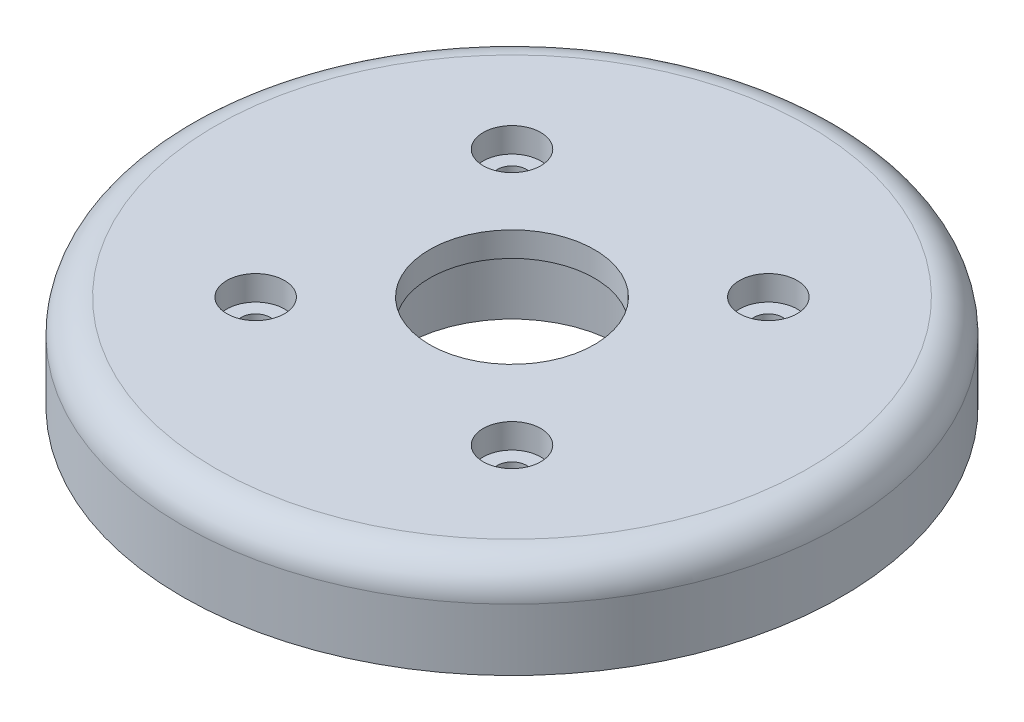
ISO-10303-21;
HEADER;
FILE_DESCRIPTION(('STEP AP214'),'2;1');
FILE_NAME('part.step','',(''),(''),'','','');
FILE_SCHEMA(('AUTOMOTIVE_DESIGN { 1 0 10303 214 1 1 1 1 }'));
ENDSEC;
DATA;
#1=APPLICATION_CONTEXT('core data for automotive mechanical design processes');
#2=APPLICATION_PROTOCOL_DEFINITION('international standard','automotive_design',2000,#1);
#3=PRODUCT_CONTEXT('',#1,'mechanical');
#4=PRODUCT('Part','Part','',(#3));
#5=PRODUCT_RELATED_PRODUCT_CATEGORY('part','',(#4));
#6=PRODUCT_DEFINITION_FORMATION('','',#4);
#7=PRODUCT_DEFINITION_CONTEXT('part definition',#1,'design');
#8=PRODUCT_DEFINITION('design','',#6,#7);
#9=PRODUCT_DEFINITION_SHAPE('','',#8);
#10=(LENGTH_UNIT() NAMED_UNIT(*) SI_UNIT(.MILLI.,.METRE.));
#11=(NAMED_UNIT(*) PLANE_ANGLE_UNIT() SI_UNIT($,.RADIAN.));
#12=(NAMED_UNIT(*) SI_UNIT($,.STERADIAN.) SOLID_ANGLE_UNIT());
#13=UNCERTAINTY_MEASURE_WITH_UNIT(LENGTH_MEASURE(1.E-05),#10,'distance_accuracy_value','');
#14=(GEOMETRIC_REPRESENTATION_CONTEXT(3) GLOBAL_UNCERTAINTY_ASSIGNED_CONTEXT((#13)) GLOBAL_UNIT_ASSIGNED_CONTEXT((#10,
#11,#12)) REPRESENTATION_CONTEXT('',''));
#15=CARTESIAN_POINT('',(0.,0.,0.));
#16=DIRECTION('',(0.,0.,1.));
#17=DIRECTION('',(1.,0.,0.));
#18=AXIS2_PLACEMENT_3D('',#15,#16,#17);
#19=CARTESIAN_POINT('',(0.,8.5,0.));
#20=DIRECTION('',(0.,1.,0.));
#21=DIRECTION('',(0.,0.,1.));
#22=AXIS2_PLACEMENT_3D('',#19,#20,#21);
#23=PLANE('',#22);
#24=CARTESIAN_POINT('',(-15.556349186104,8.5,-15.5563491861041));
#25=DIRECTION('',(0.,1.,0.));
#26=DIRECTION('',(0.,0.,1.));
#27=AXIS2_PLACEMENT_3D('',#24,#25,#26);
#28=CIRCLE('',#27,1.75);
#29=CARTESIAN_POINT('',(-15.556349186104,8.5,-13.8063491861041));
#30=VERTEX_POINT('',#29);
#31=EDGE_CURVE('E63',#30,#30,#28,.T.);
#32=ORIENTED_EDGE('',*,*,#31,.F.);
#33=EDGE_LOOP('',(#32));
#34=FACE_BOUND('',#33,.T.);
#35=CARTESIAN_POINT('',(-15.556349186104,8.5,-15.5563491861041));
#36=DIRECTION('',(0.,1.,0.));
#37=DIRECTION('',(0.,0.,1.));
#38=AXIS2_PLACEMENT_3D('',#35,#36,#37);
#39=CIRCLE('',#38,3.5);
#40=CARTESIAN_POINT('',(-15.556349186104,8.5,-12.0563491861041));
#41=VERTEX_POINT('',#40);
#42=EDGE_CURVE('E91',#41,#41,#39,.T.);
#43=ORIENTED_EDGE('',*,*,#42,.T.);
#44=EDGE_LOOP('',(#43));
#45=FACE_BOUND('',#44,.T.);
#46=ADVANCED_FACE('F37',(#34,#45),#23,.T.);
#47=CARTESIAN_POINT('',(15.5563491861041,8.5,-15.5563491861041));
#48=DIRECTION('',(0.,1.,0.));
#49=DIRECTION('',(0.,0.,1.));
#50=AXIS2_PLACEMENT_3D('',#47,#48,#49);
#51=CIRCLE('',#50,1.74999999999999);
#52=CARTESIAN_POINT('',(15.5563491861041,8.5,-13.8063491861041));
#53=VERTEX_POINT('',#52);
#54=EDGE_CURVE('E66',#53,#53,#51,.T.);
#55=ORIENTED_EDGE('',*,*,#54,.F.);
#56=EDGE_LOOP('',(#55));
#57=FACE_BOUND('',#56,.T.);
#58=CARTESIAN_POINT('',(15.5563491861041,8.5,-15.5563491861041));
#59=DIRECTION('',(0.,1.,0.));
#60=DIRECTION('',(0.,0.,1.));
#61=AXIS2_PLACEMENT_3D('',#58,#59,#60);
#62=CIRCLE('',#61,3.5);
#63=CARTESIAN_POINT('',(15.5563491861041,8.5,-12.0563491861041));
#64=VERTEX_POINT('',#63);
#65=EDGE_CURVE('E97',#64,#64,#62,.T.);
#66=ORIENTED_EDGE('',*,*,#65,.T.);
#67=EDGE_LOOP('',(#66));
#68=FACE_BOUND('',#67,.T.);
#69=ADVANCED_FACE('F138',(#57,#68),#23,.T.);
#70=CARTESIAN_POINT('',(15.5563491861041,8.5,15.556349186104));
#71=DIRECTION('',(0.,1.,0.));
#72=DIRECTION('',(0.,0.,1.));
#73=AXIS2_PLACEMENT_3D('',#70,#71,#72);
#74=CIRCLE('',#73,1.75000000000023);
#75=CARTESIAN_POINT('',(15.5563491861041,8.5,17.3063491861042));
#76=VERTEX_POINT('',#75);
#77=EDGE_CURVE('E77',#76,#76,#74,.T.);
#78=ORIENTED_EDGE('',*,*,#77,.F.);
#79=EDGE_LOOP('',(#78));
#80=FACE_BOUND('',#79,.T.);
#81=CARTESIAN_POINT('',(15.5563491861041,8.5,15.556349186104));
#82=DIRECTION('',(0.,1.,0.));
#83=DIRECTION('',(0.,0.,1.));
#84=AXIS2_PLACEMENT_3D('',#81,#82,#83);
#85=CIRCLE('',#84,3.5);
#86=CARTESIAN_POINT('',(15.5563491861041,8.5,19.056349186104));
#87=VERTEX_POINT('',#86);
#88=EDGE_CURVE('E103',#87,#87,#85,.T.);
#89=ORIENTED_EDGE('',*,*,#88,.T.);
#90=EDGE_LOOP('',(#89));
#91=FACE_BOUND('',#90,.T.);
#92=ADVANCED_FACE('F145',(#80,#91),#23,.T.);
#93=CARTESIAN_POINT('',(-15.556349186104,8.5,15.556349186104));
#94=DIRECTION('',(0.,1.,0.));
#95=DIRECTION('',(0.,0.,1.));
#96=AXIS2_PLACEMENT_3D('',#93,#94,#95);
#97=CIRCLE('',#96,1.75000000000022);
#98=CARTESIAN_POINT('',(-15.556349186104,8.5,17.3063491861042));
#99=VERTEX_POINT('',#98);
#100=EDGE_CURVE('E71',#99,#99,#97,.T.);
#101=ORIENTED_EDGE('',*,*,#100,.F.);
#102=EDGE_LOOP('',(#101));
#103=FACE_BOUND('',#102,.T.);
#104=CARTESIAN_POINT('',(-15.556349186104,8.5,15.556349186104));
#105=DIRECTION('',(0.,1.,0.));
#106=DIRECTION('',(0.,0.,1.));
#107=AXIS2_PLACEMENT_3D('',#104,#105,#106);
#108=CIRCLE('',#107,3.5);
#109=CARTESIAN_POINT('',(-15.556349186104,8.5,19.056349186104));
#110=VERTEX_POINT('',#109);
#111=EDGE_CURVE('E109',#110,#110,#108,.T.);
#112=ORIENTED_EDGE('',*,*,#111,.T.);
#113=EDGE_LOOP('',(#112));
#114=FACE_BOUND('',#113,.T.);
#115=ADVANCED_FACE('F141',(#103,#114),#23,.T.);
#116=CARTESIAN_POINT('',(0.,0.,0.));
#117=DIRECTION('',(0.,1.,0.));
#118=DIRECTION('',(0.,0.,1.));
#119=AXIS2_PLACEMENT_3D('',#116,#117,#118);
#120=PLANE('',#119);
#121=CARTESIAN_POINT('',(-15.556349186104,0.,15.556349186104));
#122=DIRECTION('',(0.,1.,0.));
#123=DIRECTION('',(0.,0.,1.));
#124=AXIS2_PLACEMENT_3D('',#121,#122,#123);
#125=CIRCLE('',#124,1.75000000000022);
#126=CARTESIAN_POINT('',(-15.556349186104,0.,17.3063491861042));
#127=VERTEX_POINT('',#126);
#128=EDGE_CURVE('E61',#127,#127,#125,.T.);
#129=ORIENTED_EDGE('',*,*,#128,.T.);
#130=EDGE_LOOP('',(#129));
#131=FACE_BOUND('',#130,.T.);
#132=CARTESIAN_POINT('',(15.5563491861041,0.,15.556349186104));
#133=DIRECTION('',(0.,1.,0.));
#134=DIRECTION('',(0.,0.,1.));
#135=AXIS2_PLACEMENT_3D('',#132,#133,#134);
#136=CIRCLE('',#135,1.75000000000023);
#137=CARTESIAN_POINT('',(15.5563491861041,0.,17.3063491861042));
#138=VERTEX_POINT('',#137);
#139=EDGE_CURVE('E74',#138,#138,#136,.T.);
#140=ORIENTED_EDGE('',*,*,#139,.T.);
#141=EDGE_LOOP('',(#140));
#142=FACE_BOUND('',#141,.T.);
#143=CARTESIAN_POINT('',(15.5563491861041,0.,-15.5563491861041));
#144=DIRECTION('',(0.,1.,0.));
#145=DIRECTION('',(0.,0.,1.));
#146=AXIS2_PLACEMENT_3D('',#143,#144,#145);
#147=CIRCLE('',#146,1.74999999999999);
#148=CARTESIAN_POINT('',(15.5563491861041,0.,-13.8063491861041));
#149=VERTEX_POINT('',#148);
#150=EDGE_CURVE('E80',#149,#149,#147,.T.);
#151=ORIENTED_EDGE('',*,*,#150,.T.);
#152=EDGE_LOOP('',(#151));
#153=FACE_BOUND('',#152,.T.);
#154=CARTESIAN_POINT('',(-15.556349186104,0.,-15.5563491861041));
#155=DIRECTION('',(0.,1.,0.));
#156=DIRECTION('',(0.,0.,1.));
#157=AXIS2_PLACEMENT_3D('',#154,#155,#156);
#158=CIRCLE('',#157,1.75);
#159=CARTESIAN_POINT('',(-15.556349186104,0.,-13.8063491861041));
#160=VERTEX_POINT('',#159);
#161=EDGE_CURVE('E57',#160,#160,#158,.T.);
#162=ORIENTED_EDGE('',*,*,#161,.T.);
#163=EDGE_LOOP('',(#162));
#164=FACE_BOUND('',#163,.T.);
#165=CARTESIAN_POINT('',(0.,0.,0.));
#166=DIRECTION('',(0.,1.,0.));
#167=DIRECTION('',(0.,0.,1.));
#168=AXIS2_PLACEMENT_3D('',#165,#166,#167);
#169=CIRCLE('',#168,40.);
#170=CARTESIAN_POINT('',(0.,0.,40.));
#171=VERTEX_POINT('',#170);
#172=EDGE_CURVE('E48',#171,#171,#169,.T.);
#173=ORIENTED_EDGE('',*,*,#172,.F.);
#174=EDGE_LOOP('',(#173));
#175=FACE_BOUND('',#174,.T.);
#176=CARTESIAN_POINT('',(0.,0.,0.));
#177=DIRECTION('',(0.,1.,0.));
#178=DIRECTION('',(0.,0.,1.));
#179=AXIS2_PLACEMENT_3D('',#176,#177,#178);
#180=CIRCLE('',#179,13.);
#181=CARTESIAN_POINT('',(0.,0.,13.));
#182=VERTEX_POINT('',#181);
#183=EDGE_CURVE('E52',#182,#182,#180,.T.);
#184=ORIENTED_EDGE('',*,*,#183,.T.);
#185=EDGE_LOOP('',(#184));
#186=FACE_BOUND('',#185,.T.);
#187=ADVANCED_FACE('F152',(#131,#142,#153,#164,#175,#186),#120,.F.);
#188=CARTESIAN_POINT('',(0.,8.5,0.));
#189=DIRECTION('',(0.,-1.,0.));
#190=DIRECTION('',(0.,0.,-1.));
#191=AXIS2_PLACEMENT_3D('',#188,#189,#190);
#192=CYLINDRICAL_SURFACE('',#191,40.);
#193=CARTESIAN_POINT('',(0.,7.5,0.));
#194=DIRECTION('',(0.,1.,0.));
#195=DIRECTION('',(0.,0.,1.));
#196=AXIS2_PLACEMENT_3D('',#193,#194,#195);
#197=CIRCLE('',#196,40.);
#198=CARTESIAN_POINT('',(0.,7.5,40.));
#199=VERTEX_POINT('',#198);
#200=EDGE_CURVE('E10',#199,#199,#197,.F.);
#201=ORIENTED_EDGE('',*,*,#200,.T.);
#202=EDGE_LOOP('',(#201));
#203=FACE_BOUND('',#202,.T.);
#204=ORIENTED_EDGE('',*,*,#172,.T.);
#205=EDGE_LOOP('',(#204));
#206=FACE_BOUND('',#205,.T.);
#207=ADVANCED_FACE('F158',(#203,#206),#192,.T.);
#208=CARTESIAN_POINT('',(0.,8.5,0.));
#209=DIRECTION('',(0.,-1.,0.));
#210=DIRECTION('',(0.,0.,-1.));
#211=AXIS2_PLACEMENT_3D('',#208,#209,#210);
#212=CYLINDRICAL_SURFACE('',#211,13.);
#213=CARTESIAN_POINT('',(0.,8.5,0.));
#214=DIRECTION('',(0.,1.,0.));
#215=DIRECTION('',(0.,0.,1.));
#216=AXIS2_PLACEMENT_3D('',#213,#214,#215);
#217=CIRCLE('',#216,13.);
#218=CARTESIAN_POINT('',(0.,8.5,13.));
#219=VERTEX_POINT('',#218);
#220=EDGE_CURVE('E58',#219,#219,#217,.T.);
#221=ORIENTED_EDGE('',*,*,#220,.T.);
#222=EDGE_LOOP('',(#221));
#223=FACE_BOUND('',#222,.T.);
#224=ORIENTED_EDGE('',*,*,#183,.F.);
#225=EDGE_LOOP('',(#224));
#226=FACE_BOUND('',#225,.T.);
#227=ADVANCED_FACE('F286',(#223,#226),#212,.F.);
#228=CARTESIAN_POINT('',(-15.556349186104,0.,-15.5563491861041));
#229=DIRECTION('',(0.,1.,0.));
#230=DIRECTION('',(0.,0.,1.));
#231=AXIS2_PLACEMENT_3D('',#228,#229,#230);
#232=CYLINDRICAL_SURFACE('',#231,1.75);
#233=ORIENTED_EDGE('',*,*,#161,.F.);
#234=EDGE_LOOP('',(#233));
#235=FACE_BOUND('',#234,.T.);
#236=ORIENTED_EDGE('',*,*,#31,.T.);
#237=EDGE_LOOP('',(#236));
#238=FACE_BOUND('',#237,.T.);
#239=ADVANCED_FACE('F277',(#235,#238),#232,.F.);
#240=CARTESIAN_POINT('',(15.5563491861041,0.,-15.5563491861041));
#241=DIRECTION('',(0.,1.,0.));
#242=DIRECTION('',(0.,0.,1.));
#243=AXIS2_PLACEMENT_3D('',#240,#241,#242);
#244=CYLINDRICAL_SURFACE('',#243,1.74999999999999);
#245=ORIENTED_EDGE('',*,*,#150,.F.);
#246=EDGE_LOOP('',(#245));
#247=FACE_BOUND('',#246,.T.);
#248=ORIENTED_EDGE('',*,*,#54,.T.);
#249=EDGE_LOOP('',(#248));
#250=FACE_BOUND('',#249,.T.);
#251=ADVANCED_FACE('F268',(#247,#250),#244,.F.);
#252=CARTESIAN_POINT('',(15.5563491861041,0.,15.556349186104));
#253=DIRECTION('',(0.,1.,0.));
#254=DIRECTION('',(0.,0.,1.));
#255=AXIS2_PLACEMENT_3D('',#252,#253,#254);
#256=CYLINDRICAL_SURFACE('',#255,1.75000000000023);
#257=ORIENTED_EDGE('',*,*,#139,.F.);
#258=EDGE_LOOP('',(#257));
#259=FACE_BOUND('',#258,.T.);
#260=ORIENTED_EDGE('',*,*,#77,.T.);
#261=EDGE_LOOP('',(#260));
#262=FACE_BOUND('',#261,.T.);
#263=ADVANCED_FACE('F132',(#259,#262),#256,.F.);
#264=CARTESIAN_POINT('',(-15.556349186104,0.,15.556349186104));
#265=DIRECTION('',(0.,1.,0.));
#266=DIRECTION('',(0.,0.,1.));
#267=AXIS2_PLACEMENT_3D('',#264,#265,#266);
#268=CYLINDRICAL_SURFACE('',#267,1.75000000000022);
#269=ORIENTED_EDGE('',*,*,#128,.F.);
#270=EDGE_LOOP('',(#269));
#271=FACE_BOUND('',#270,.T.);
#272=ORIENTED_EDGE('',*,*,#100,.T.);
#273=EDGE_LOOP('',(#272));
#274=FACE_BOUND('',#273,.T.);
#275=ADVANCED_FACE('F121',(#271,#274),#268,.F.);
#276=CARTESIAN_POINT('',(0.,11.5,0.));
#277=DIRECTION('',(0.,1.,0.));
#278=DIRECTION('',(0.,0.,1.));
#279=AXIS2_PLACEMENT_3D('',#276,#277,#278);
#280=PLANE('',#279);
#281=CARTESIAN_POINT('',(0.,11.5,0.));
#282=DIRECTION('',(0.,1.,0.));
#283=DIRECTION('',(0.,0.,1.));
#284=AXIS2_PLACEMENT_3D('',#281,#282,#283);
#285=CIRCLE('',#284,36.);
#286=CARTESIAN_POINT('',(0.,11.5,36.));
#287=VERTEX_POINT('',#286);
#288=EDGE_CURVE('E44',#287,#287,#285,.T.);
#289=ORIENTED_EDGE('',*,*,#288,.T.);
#290=EDGE_LOOP('',(#289));
#291=FACE_BOUND('',#290,.T.);
#292=CARTESIAN_POINT('',(15.5563491861041,11.5,15.556349186104));
#293=DIRECTION('',(0.,1.,0.));
#294=DIRECTION('',(0.,0.,1.));
#295=AXIS2_PLACEMENT_3D('',#292,#293,#294);
#296=CIRCLE('',#295,3.5);
#297=CARTESIAN_POINT('',(15.5563491861041,11.5,19.056349186104));
#298=VERTEX_POINT('',#297);
#299=EDGE_CURVE('E100',#298,#298,#296,.T.);
#300=ORIENTED_EDGE('',*,*,#299,.F.);
#301=EDGE_LOOP('',(#300));
#302=FACE_BOUND('',#301,.T.);
#303=CARTESIAN_POINT('',(-15.556349186104,11.5,-15.5563491861041));
#304=DIRECTION('',(0.,1.,0.));
#305=DIRECTION('',(0.,0.,1.));
#306=AXIS2_PLACEMENT_3D('',#303,#304,#305);
#307=CIRCLE('',#306,3.5);
#308=CARTESIAN_POINT('',(-15.556349186104,11.5,-12.0563491861041));
#309=VERTEX_POINT('',#308);
#310=EDGE_CURVE('E88',#309,#309,#307,.T.);
#311=ORIENTED_EDGE('',*,*,#310,.F.);
#312=EDGE_LOOP('',(#311));
#313=FACE_BOUND('',#312,.T.);
#314=CARTESIAN_POINT('',(0.,11.5,0.));
#315=DIRECTION('',(0.,1.,0.));
#316=DIRECTION('',(0.,0.,1.));
#317=AXIS2_PLACEMENT_3D('',#314,#315,#316);
#318=CIRCLE('',#317,10.);
#319=CARTESIAN_POINT('',(0.,11.5,10.));
#320=VERTEX_POINT('',#319);
#321=EDGE_CURVE('E62',#320,#320,#318,.T.);
#322=ORIENTED_EDGE('',*,*,#321,.F.);
#323=EDGE_LOOP('',(#322));
#324=FACE_BOUND('',#323,.T.);
#325=CARTESIAN_POINT('',(15.5563491861041,11.5,-15.5563491861041));
#326=DIRECTION('',(0.,1.,0.));
#327=DIRECTION('',(0.,0.,1.));
#328=AXIS2_PLACEMENT_3D('',#325,#326,#327);
#329=CIRCLE('',#328,3.5);
#330=CARTESIAN_POINT('',(15.5563491861041,11.5,-12.0563491861041));
#331=VERTEX_POINT('',#330);
#332=EDGE_CURVE('E94',#331,#331,#329,.T.);
#333=ORIENTED_EDGE('',*,*,#332,.F.);
#334=EDGE_LOOP('',(#333));
#335=FACE_BOUND('',#334,.T.);
#336=CARTESIAN_POINT('',(-15.556349186104,11.5,15.556349186104));
#337=DIRECTION('',(0.,1.,0.));
#338=DIRECTION('',(0.,0.,1.));
#339=AXIS2_PLACEMENT_3D('',#336,#337,#338);
#340=CIRCLE('',#339,3.5);
#341=CARTESIAN_POINT('',(-15.556349186104,11.5,19.056349186104));
#342=VERTEX_POINT('',#341);
#343=EDGE_CURVE('E106',#342,#342,#340,.T.);
#344=ORIENTED_EDGE('',*,*,#343,.F.);
#345=EDGE_LOOP('',(#344));
#346=FACE_BOUND('',#345,.T.);
#347=ADVANCED_FACE('F118',(#291,#302,#313,#324,#335,#346),#280,.T.);
#348=CARTESIAN_POINT('',(0.,8.5,0.));
#349=DIRECTION('',(0.,1.,0.));
#350=DIRECTION('',(0.,0.,1.));
#351=AXIS2_PLACEMENT_3D('',#348,#349,#350);
#352=PLANE('',#351);
#353=ORIENTED_EDGE('',*,*,#220,.F.);
#354=EDGE_LOOP('',(#353));
#355=FACE_BOUND('',#354,.T.);
#356=CARTESIAN_POINT('',(0.,8.5,0.));
#357=DIRECTION('',(0.,1.,0.));
#358=DIRECTION('',(0.,0.,1.));
#359=AXIS2_PLACEMENT_3D('',#356,#357,#358);
#360=CIRCLE('',#359,10.);
#361=CARTESIAN_POINT('',(0.,8.5,10.));
#362=VERTEX_POINT('',#361);
#363=EDGE_CURVE('E85',#362,#362,#360,.T.);
#364=ORIENTED_EDGE('',*,*,#363,.T.);
#365=EDGE_LOOP('',(#364));
#366=FACE_BOUND('',#365,.T.);
#367=ADVANCED_FACE('F120',(#355,#366),#352,.F.);
#368=CARTESIAN_POINT('',(0.,11.5,0.));
#369=DIRECTION('',(0.,-1.,0.));
#370=DIRECTION('',(0.,0.,-1.));
#371=AXIS2_PLACEMENT_3D('',#368,#369,#370);
#372=CYLINDRICAL_SURFACE('',#371,10.);
#373=ORIENTED_EDGE('',*,*,#321,.T.);
#374=EDGE_LOOP('',(#373));
#375=FACE_BOUND('',#374,.T.);
#376=ORIENTED_EDGE('',*,*,#363,.F.);
#377=EDGE_LOOP('',(#376));
#378=FACE_BOUND('',#377,.T.);
#379=ADVANCED_FACE('F128',(#375,#378),#372,.F.);
#380=CARTESIAN_POINT('',(-15.556349186104,11.5,-15.5563491861041));
#381=DIRECTION('',(0.,-1.,0.));
#382=DIRECTION('',(0.,0.,-1.));
#383=AXIS2_PLACEMENT_3D('',#380,#381,#382);
#384=CYLINDRICAL_SURFACE('',#383,3.5);
#385=ORIENTED_EDGE('',*,*,#310,.T.);
#386=EDGE_LOOP('',(#385));
#387=FACE_BOUND('',#386,.T.);
#388=ORIENTED_EDGE('',*,*,#42,.F.);
#389=EDGE_LOOP('',(#388));
#390=FACE_BOUND('',#389,.T.);
#391=ADVANCED_FACE('F177',(#387,#390),#384,.F.);
#392=CARTESIAN_POINT('',(15.5563491861041,11.5,-15.5563491861041));
#393=DIRECTION('',(0.,-1.,0.));
#394=DIRECTION('',(0.,0.,-1.));
#395=AXIS2_PLACEMENT_3D('',#392,#393,#394);
#396=CYLINDRICAL_SURFACE('',#395,3.5);
#397=ORIENTED_EDGE('',*,*,#332,.T.);
#398=EDGE_LOOP('',(#397));
#399=FACE_BOUND('',#398,.T.);
#400=ORIENTED_EDGE('',*,*,#65,.F.);
#401=EDGE_LOOP('',(#400));
#402=FACE_BOUND('',#401,.T.);
#403=ADVANCED_FACE('F171',(#399,#402),#396,.F.);
#404=CARTESIAN_POINT('',(15.5563491861041,11.5,15.556349186104));
#405=DIRECTION('',(0.,-1.,0.));
#406=DIRECTION('',(0.,0.,-1.));
#407=AXIS2_PLACEMENT_3D('',#404,#405,#406);
#408=CYLINDRICAL_SURFACE('',#407,3.5);
#409=ORIENTED_EDGE('',*,*,#299,.T.);
#410=EDGE_LOOP('',(#409));
#411=FACE_BOUND('',#410,.T.);
#412=ORIENTED_EDGE('',*,*,#88,.F.);
#413=EDGE_LOOP('',(#412));
#414=FACE_BOUND('',#413,.T.);
#415=ADVANCED_FACE('F165',(#411,#414),#408,.F.);
#416=CARTESIAN_POINT('',(-15.556349186104,11.5,15.556349186104));
#417=DIRECTION('',(0.,-1.,0.));
#418=DIRECTION('',(0.,0.,-1.));
#419=AXIS2_PLACEMENT_3D('',#416,#417,#418);
#420=CYLINDRICAL_SURFACE('',#419,3.5);
#421=ORIENTED_EDGE('',*,*,#343,.T.);
#422=EDGE_LOOP('',(#421));
#423=FACE_BOUND('',#422,.T.);
#424=ORIENTED_EDGE('',*,*,#111,.F.);
#425=EDGE_LOOP('',(#424));
#426=FACE_BOUND('',#425,.T.);
#427=ADVANCED_FACE('F115',(#423,#426),#420,.F.);
#428=CARTESIAN_POINT('',(0.,7.5,0.));
#429=DIRECTION('',(0.,1.,0.));
#430=DIRECTION('',(0.,0.,1.));
#431=AXIS2_PLACEMENT_3D('',#428,#429,#430);
#432=TOROIDAL_SURFACE('',#431,36.,4.);
#433=ORIENTED_EDGE('',*,*,#200,.F.);
#434=EDGE_LOOP('',(#433));
#435=FACE_BOUND('',#434,.T.);
#436=ORIENTED_EDGE('',*,*,#288,.F.);
#437=EDGE_LOOP('',(#436));
#438=FACE_BOUND('',#437,.T.);
#439=ADVANCED_FACE('F39',(#435,#438),#432,.T.);
#440=CLOSED_SHELL('',(#46,#69,#92,#115,#187,#207,#227,#239,#251,#263,#275,#347,#367,#379,#391,
#403,#415,#427,#439));
#441=MANIFOLD_SOLID_BREP('B2',#440);
#442=ADVANCED_BREP_SHAPE_REPRESENTATION('',(#18,#441),#14);
#443=SHAPE_DEFINITION_REPRESENTATION(#9,#442);
ENDSEC;
END-ISO-10303-21;
